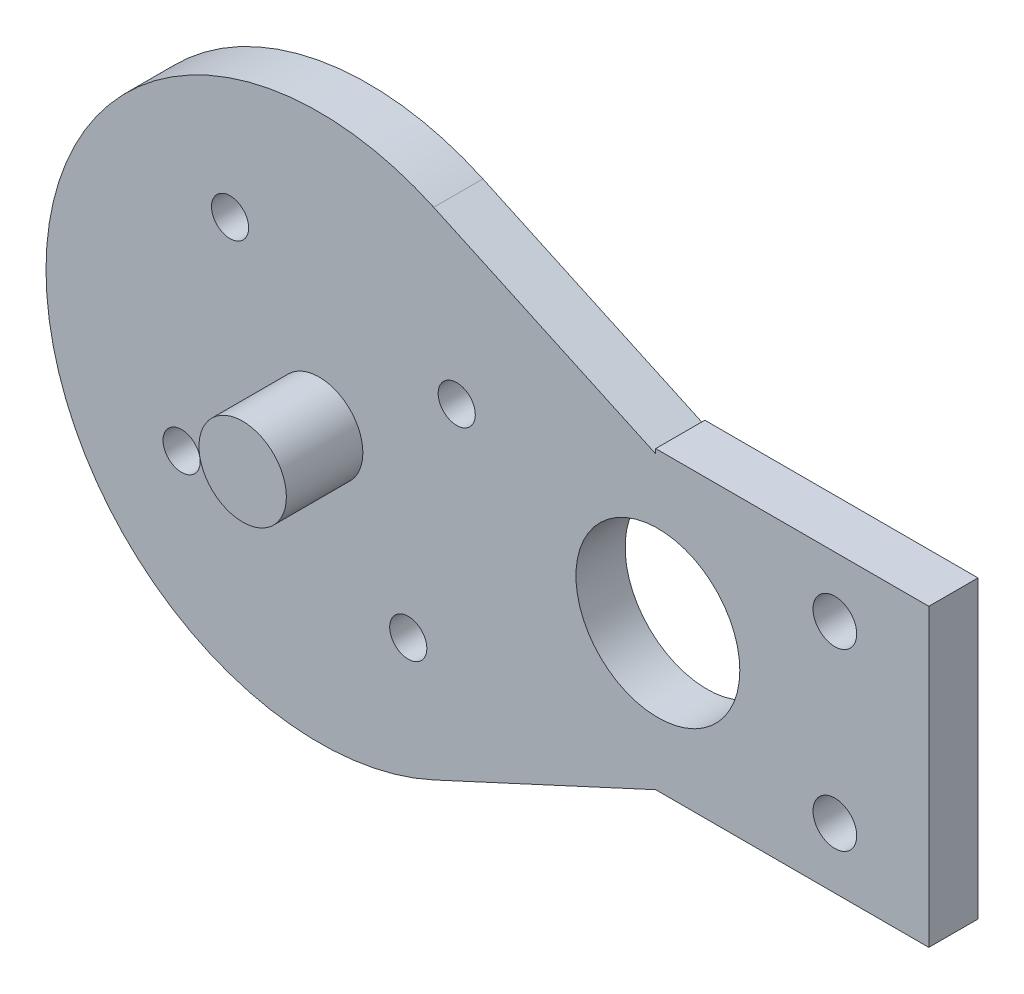
ISO-10303-21;
HEADER;
FILE_DESCRIPTION(('STEP AP214'),'2;1');
FILE_NAME('part.step','',(''),(''),'','','');
FILE_SCHEMA(('AUTOMOTIVE_DESIGN { 1 0 10303 214 1 1 1 1 }'));
ENDSEC;
DATA;
#1=APPLICATION_CONTEXT('core data for automotive mechanical design processes');
#2=APPLICATION_PROTOCOL_DEFINITION('international standard','automotive_design',2000,#1);
#3=PRODUCT_CONTEXT('',#1,'mechanical');
#4=PRODUCT('Part','Part','',(#3));
#5=PRODUCT_RELATED_PRODUCT_CATEGORY('part','',(#4));
#6=PRODUCT_DEFINITION_FORMATION('','',#4);
#7=PRODUCT_DEFINITION_CONTEXT('part definition',#1,'design');
#8=PRODUCT_DEFINITION('design','',#6,#7);
#9=PRODUCT_DEFINITION_SHAPE('','',#8);
#10=(LENGTH_UNIT() NAMED_UNIT(*) SI_UNIT(.MILLI.,.METRE.));
#11=(NAMED_UNIT(*) PLANE_ANGLE_UNIT() SI_UNIT($,.RADIAN.));
#12=(NAMED_UNIT(*) SI_UNIT($,.STERADIAN.) SOLID_ANGLE_UNIT());
#13=UNCERTAINTY_MEASURE_WITH_UNIT(LENGTH_MEASURE(1.E-05),#10,'distance_accuracy_value','');
#14=(GEOMETRIC_REPRESENTATION_CONTEXT(3) GLOBAL_UNCERTAINTY_ASSIGNED_CONTEXT((#13)) GLOBAL_UNIT_ASSIGNED_CONTEXT((#10,
#11,#12)) REPRESENTATION_CONTEXT('',''));
#15=CARTESIAN_POINT('',(0.,0.,0.));
#16=DIRECTION('',(0.,0.,1.));
#17=DIRECTION('',(1.,0.,0.));
#18=AXIS2_PLACEMENT_3D('',#15,#16,#17);
#19=CARTESIAN_POINT('',(47.1978168557016,-7.77364887585196,-36.8242867378433));
#20=DIRECTION('',(0.,0.,1.));
#21=DIRECTION('',(1.,0.,0.));
#22=AXIS2_PLACEMENT_3D('',#19,#20,#21);
#23=CYLINDRICAL_SURFACE('',#22,0.999999999999984);
#24=CARTESIAN_POINT('',(47.1978168557016,-7.77364887585196,0.));
#25=DIRECTION('',(0.,0.,1.));
#26=DIRECTION('',(1.,0.,0.));
#27=AXIS2_PLACEMENT_3D('',#24,#25,#26);
#28=CIRCLE('',#27,0.999999999999984);
#29=CARTESIAN_POINT('',(48.1978168557016,-7.77364887585196,0.));
#30=VERTEX_POINT('',#29);
#31=EDGE_CURVE('E133',#30,#30,#28,.F.);
#32=ORIENTED_EDGE('',*,*,#31,.T.);
#33=EDGE_LOOP('',(#32));
#34=FACE_BOUND('',#33,.T.);
#35=CARTESIAN_POINT('',(47.1978168557016,-7.77364887585196,1.5));
#36=DIRECTION('',(0.,0.,1.));
#37=DIRECTION('',(1.,0.,0.));
#38=AXIS2_PLACEMENT_3D('',#35,#36,#37);
#39=CIRCLE('',#38,0.999999999999984);
#40=CARTESIAN_POINT('',(48.1978168557016,-7.77364887585196,1.5));
#41=VERTEX_POINT('',#40);
#42=EDGE_CURVE('E39',#41,#41,#39,.F.);
#43=ORIENTED_EDGE('',*,*,#42,.F.);
#44=EDGE_LOOP('',(#43));
#45=FACE_BOUND('',#44,.T.);
#46=ADVANCED_FACE('F35',(#34,#45),#23,.F.);
#47=CARTESIAN_POINT('',(47.1978168557015,8.22635112414804,-36.8242867378433));
#48=DIRECTION('',(0.,0.,1.));
#49=DIRECTION('',(1.,0.,0.));
#50=AXIS2_PLACEMENT_3D('',#47,#48,#49);
#51=CYLINDRICAL_SURFACE('',#50,0.999999999999991);
#52=CARTESIAN_POINT('',(47.1978168557015,8.22635112414804,0.));
#53=DIRECTION('',(0.,0.,1.));
#54=DIRECTION('',(1.,0.,0.));
#55=AXIS2_PLACEMENT_3D('',#52,#53,#54);
#56=CIRCLE('',#55,0.999999999999991);
#57=CARTESIAN_POINT('',(48.1978168557015,8.22635112414804,0.));
#58=VERTEX_POINT('',#57);
#59=EDGE_CURVE('E129',#58,#58,#56,.F.);
#60=ORIENTED_EDGE('',*,*,#59,.T.);
#61=EDGE_LOOP('',(#60));
#62=FACE_BOUND('',#61,.T.);
#63=CARTESIAN_POINT('',(47.1978168557015,8.22635112414804,1.5));
#64=DIRECTION('',(0.,0.,1.));
#65=DIRECTION('',(1.,0.,0.));
#66=AXIS2_PLACEMENT_3D('',#63,#64,#65);
#67=CIRCLE('',#66,0.999999999999991);
#68=CARTESIAN_POINT('',(48.1978168557015,8.22635112414804,1.5));
#69=VERTEX_POINT('',#68);
#70=EDGE_CURVE('E221',#69,#69,#67,.F.);
#71=ORIENTED_EDGE('',*,*,#70,.F.);
#72=EDGE_LOOP('',(#71));
#73=FACE_BOUND('',#72,.T.);
#74=ADVANCED_FACE('F265',(#62,#73),#51,.F.);
#75=CARTESIAN_POINT('',(36.0322580645161,-10.8938688615254,4.5));
#76=DIRECTION('',(-0.419354838709678,0.907822405127115,0.));
#77=DIRECTION('',(-0.907822405127115,-0.419354838709678,0.));
#78=AXIS2_PLACEMENT_3D('',#75,#76,#77);
#79=PLANE('',#78);
#80=DIRECTION('',(0.,0.,1.));
#81=VECTOR('',#80,1.);
#82=CARTESIAN_POINT('',(30.7986447857433,-13.3114574118777,-36.8242867378433));
#83=LINE('',#82,#81);
#84=CARTESIAN_POINT('',(30.7986447857433,-13.3114574118777,0.));
#85=VERTEX_POINT('',#84);
#86=CARTESIAN_POINT('',(30.7986447857433,-13.3114574118777,4.5));
#87=VERTEX_POINT('',#86);
#88=EDGE_CURVE('E144',#85,#87,#83,.T.);
#89=ORIENTED_EDGE('',*,*,#88,.T.);
#90=DIRECTION('',(0.907822405127115,0.419354838709678,0.));
#91=VECTOR('',#90,1.);
#92=CARTESIAN_POINT('',(36.0322580645161,-10.8938688615254,4.5));
#93=LINE('',#92,#91);
#94=CARTESIAN_POINT('',(10.4838709677419,-22.6955601281779,4.5));
#95=VERTEX_POINT('',#94);
#96=EDGE_CURVE('E202',#95,#87,#93,.T.);
#97=ORIENTED_EDGE('',*,*,#96,.F.);
#98=DIRECTION('',(0.,0.,-1.));
#99=VECTOR('',#98,1.);
#100=CARTESIAN_POINT('',(10.4838709677419,-22.6955601281779,4.5));
#101=LINE('',#100,#99);
#102=CARTESIAN_POINT('',(10.4838709677419,-22.6955601281779,0.));
#103=VERTEX_POINT('',#102);
#104=EDGE_CURVE('E11',#95,#103,#101,.T.);
#105=ORIENTED_EDGE('',*,*,#104,.T.);
#106=DIRECTION('',(0.907822405127115,0.419354838709678,0.));
#107=VECTOR('',#106,1.);
#108=CARTESIAN_POINT('',(36.0322580645161,-10.8938688615254,0.));
#109=LINE('',#108,#107);
#110=EDGE_CURVE('E207',#103,#85,#109,.T.);
#111=ORIENTED_EDGE('',*,*,#110,.T.);
#112=EDGE_LOOP('',(#89,#97,#105,#111));
#113=FACE_BOUND('',#112,.T.);
#114=ADVANCED_FACE('F245',(#113),#79,.F.);
#115=CARTESIAN_POINT('',(0.,0.,4.5));
#116=DIRECTION('',(0.,0.,1.));
#117=DIRECTION('',(1.,0.,0.));
#118=AXIS2_PLACEMENT_3D('',#115,#116,#117);
#119=PLANE('',#118);
#120=CARTESIAN_POINT('',(47.1978168557015,8.22635112414804,4.5));
#121=DIRECTION('',(0.,0.,1.));
#122=DIRECTION('',(1.,0.,0.));
#123=AXIS2_PLACEMENT_3D('',#120,#121,#122);
#124=CIRCLE('',#123,2.);
#125=CARTESIAN_POINT('',(49.1978168557015,8.22635112414804,4.5));
#126=VERTEX_POINT('',#125);
#127=EDGE_CURVE('E228',#126,#126,#124,.T.);
#128=ORIENTED_EDGE('',*,*,#127,.F.);
#129=EDGE_LOOP('',(#128));
#130=FACE_BOUND('',#129,.T.);
#131=CARTESIAN_POINT('',(47.1978168557016,-7.77364887585196,4.5));
#132=DIRECTION('',(0.,0.,1.));
#133=DIRECTION('',(1.,0.,0.));
#134=AXIS2_PLACEMENT_3D('',#131,#132,#133);
#135=CIRCLE('',#134,2.);
#136=CARTESIAN_POINT('',(49.1978168557016,-7.77364887585196,4.5));
#137=VERTEX_POINT('',#136);
#138=EDGE_CURVE('E238',#137,#137,#135,.T.);
#139=ORIENTED_EDGE('',*,*,#138,.F.);
#140=EDGE_LOOP('',(#139));
#141=FACE_BOUND('',#140,.T.);
#142=DIRECTION('',(0.,-1.,0.));
#143=VECTOR('',#142,1.);
#144=CARTESIAN_POINT('',(30.7986447857433,0.,4.5));
#145=LINE('',#144,#143);
#146=CARTESIAN_POINT('',(30.7986447857433,13.7260737947784,4.5));
#147=VERTEX_POINT('',#146);
#148=CARTESIAN_POINT('',(30.7986447857433,13.3114574118777,4.5));
#149=VERTEX_POINT('',#148);
#150=EDGE_CURVE('E125',#147,#149,#145,.T.);
#151=ORIENTED_EDGE('',*,*,#150,.T.);
#152=DIRECTION('',(-0.907822405127115,0.419354838709677,0.));
#153=VECTOR('',#152,1.);
#154=CARTESIAN_POINT('',(10.4838709677419,22.6955601281779,4.5));
#155=LINE('',#154,#153);
#156=CARTESIAN_POINT('',(10.4838709677419,22.6955601281779,4.5));
#157=VERTEX_POINT('',#156);
#158=EDGE_CURVE('E54',#149,#157,#155,.T.);
#159=ORIENTED_EDGE('',*,*,#158,.T.);
#160=CARTESIAN_POINT('',(0.,0.,4.5));
#161=DIRECTION('',(0.,0.,1.));
#162=DIRECTION('',(1.,0.,0.));
#163=AXIS2_PLACEMENT_3D('',#160,#161,#162);
#164=CIRCLE('',#163,25.);
#165=EDGE_CURVE('E200',#157,#95,#164,.T.);
#166=ORIENTED_EDGE('',*,*,#165,.T.);
#167=ORIENTED_EDGE('',*,*,#96,.T.);
#168=DIRECTION('',(-1.,0.,0.));
#169=VECTOR('',#168,1.);
#170=CARTESIAN_POINT('',(0.,-13.3114574118777,4.5));
#171=LINE('',#170,#169);
#172=CARTESIAN_POINT('',(55.7986447857433,-13.3114574118777,4.5));
#173=VERTEX_POINT('',#172);
#174=EDGE_CURVE('E118',#173,#87,#171,.T.);
#175=ORIENTED_EDGE('',*,*,#174,.F.);
#176=DIRECTION('',(0.,-1.,0.));
#177=VECTOR('',#176,1.);
#178=CARTESIAN_POINT('',(55.7986447857433,0.,4.5));
#179=LINE('',#178,#177);
#180=CARTESIAN_POINT('',(55.7986447857433,13.7260737947784,4.5));
#181=VERTEX_POINT('',#180);
#182=EDGE_CURVE('E107',#181,#173,#179,.T.);
#183=ORIENTED_EDGE('',*,*,#182,.F.);
#184=DIRECTION('',(-1.,0.,0.));
#185=VECTOR('',#184,1.);
#186=CARTESIAN_POINT('',(0.,13.7260737947784,4.5));
#187=LINE('',#186,#185);
#188=EDGE_CURVE('E116',#181,#147,#187,.T.);
#189=ORIENTED_EDGE('',*,*,#188,.T.);
#190=EDGE_LOOP('',(#151,#159,#166,#167,#175,#183,#189));
#191=FACE_BOUND('',#190,.T.);
#192=CARTESIAN_POINT('',(31.,0.,4.5));
#193=DIRECTION('',(0.,0.,1.));
#194=DIRECTION('',(1.,0.,0.));
#195=AXIS2_PLACEMENT_3D('',#192,#193,#194);
#196=CIRCLE('',#195,7.5);
#197=CARTESIAN_POINT('',(38.5,0.,4.5));
#198=VERTEX_POINT('',#197);
#199=EDGE_CURVE('E192',#198,#198,#196,.T.);
#200=ORIENTED_EDGE('',*,*,#199,.F.);
#201=EDGE_LOOP('',(#200));
#202=FACE_BOUND('',#201,.T.);
#203=CARTESIAN_POINT('',(0.,0.,4.5));
#204=DIRECTION('',(0.,0.,1.));
#205=DIRECTION('',(1.,0.,0.));
#206=AXIS2_PLACEMENT_3D('',#203,#204,#205);
#207=CIRCLE('',#206,4.);
#208=CARTESIAN_POINT('',(4.,0.,4.5));
#209=VERTEX_POINT('',#208);
#210=EDGE_CURVE('E178',#209,#209,#207,.T.);
#211=ORIENTED_EDGE('',*,*,#210,.F.);
#212=EDGE_LOOP('',(#211));
#213=FACE_BOUND('',#212,.T.);
#214=CARTESIAN_POINT('',(-12.5899519946081,-8.15433067599359,4.5));
#215=DIRECTION('',(0.,0.,1.));
#216=DIRECTION('',(1.,0.,0.));
#217=AXIS2_PLACEMENT_3D('',#214,#215,#216);
#218=CIRCLE('',#217,1.7);
#219=CARTESIAN_POINT('',(-10.8899519946081,-8.15433067599359,4.5));
#220=VERTEX_POINT('',#219);
#221=EDGE_CURVE('E141',#220,#220,#218,.T.);
#222=ORIENTED_EDGE('',*,*,#221,.F.);
#223=EDGE_LOOP('',(#222));
#224=FACE_BOUND('',#223,.T.);
#225=CARTESIAN_POINT('',(8.15433067599418,-12.5899519946082,4.5));
#226=DIRECTION('',(0.,0.,1.));
#227=DIRECTION('',(1.,0.,0.));
#228=AXIS2_PLACEMENT_3D('',#225,#226,#227);
#229=CIRCLE('',#228,1.7);
#230=CARTESIAN_POINT('',(9.85433067599419,-12.5899519946082,4.5));
#231=VERTEX_POINT('',#230);
#232=EDGE_CURVE('E167',#231,#231,#229,.T.);
#233=ORIENTED_EDGE('',*,*,#232,.F.);
#234=EDGE_LOOP('',(#233));
#235=FACE_BOUND('',#234,.T.);
#236=CARTESIAN_POINT('',(12.5899519946088,8.15433067599406,4.5));
#237=DIRECTION('',(0.,0.,1.));
#238=DIRECTION('',(1.,0.,0.));
#239=AXIS2_PLACEMENT_3D('',#236,#237,#238);
#240=CIRCLE('',#239,1.7);
#241=CARTESIAN_POINT('',(14.2899519946088,8.15433067599406,4.5));
#242=VERTEX_POINT('',#241);
#243=EDGE_CURVE('E161',#242,#242,#240,.T.);
#244=ORIENTED_EDGE('',*,*,#243,.F.);
#245=EDGE_LOOP('',(#244));
#246=FACE_BOUND('',#245,.T.);
#247=CARTESIAN_POINT('',(-8.15433067599347,12.5899519946087,4.5));
#248=DIRECTION('',(0.,0.,1.));
#249=DIRECTION('',(1.,0.,0.));
#250=AXIS2_PLACEMENT_3D('',#247,#248,#249);
#251=CIRCLE('',#250,1.7);
#252=CARTESIAN_POINT('',(-6.45433067599347,12.5899519946087,4.5));
#253=VERTEX_POINT('',#252);
#254=EDGE_CURVE('E155',#253,#253,#251,.T.);
#255=ORIENTED_EDGE('',*,*,#254,.F.);
#256=EDGE_LOOP('',(#255));
#257=FACE_BOUND('',#256,.T.);
#258=ADVANCED_FACE('F114',(#130,#141,#191,#202,#213,#224,#235,#246,#257),#119,.T.);
#259=CARTESIAN_POINT('',(0.,0.,0.));
#260=DIRECTION('',(0.,0.,1.));
#261=DIRECTION('',(1.,0.,0.));
#262=AXIS2_PLACEMENT_3D('',#259,#260,#261);
#263=PLANE('',#262);
#264=DIRECTION('',(1.,0.,0.));
#265=VECTOR('',#264,1.);
#266=CARTESIAN_POINT('',(0.,-13.3114574118777,0.));
#267=LINE('',#266,#265);
#268=CARTESIAN_POINT('',(55.7986447857433,-13.3114574118777,0.));
#269=VERTEX_POINT('',#268);
#270=EDGE_CURVE('E119',#85,#269,#267,.T.);
#271=ORIENTED_EDGE('',*,*,#270,.F.);
#272=ORIENTED_EDGE('',*,*,#110,.F.);
#273=CARTESIAN_POINT('',(0.,0.,0.));
#274=DIRECTION('',(0.,0.,1.));
#275=DIRECTION('',(1.,0.,0.));
#276=AXIS2_PLACEMENT_3D('',#273,#274,#275);
#277=CIRCLE('',#276,25.);
#278=CARTESIAN_POINT('',(10.4838709677419,22.6955601281779,0.));
#279=VERTEX_POINT('',#278);
#280=EDGE_CURVE('E65',#279,#103,#277,.T.);
#281=ORIENTED_EDGE('',*,*,#280,.F.);
#282=DIRECTION('',(-0.907822405127115,0.419354838709677,0.));
#283=VECTOR('',#282,1.);
#284=CARTESIAN_POINT('',(10.4838709677419,22.6955601281779,0.));
#285=LINE('',#284,#283);
#286=CARTESIAN_POINT('',(30.7986447857433,13.3114574118777,0.));
#287=VERTEX_POINT('',#286);
#288=EDGE_CURVE('E203',#287,#279,#285,.T.);
#289=ORIENTED_EDGE('',*,*,#288,.F.);
#290=DIRECTION('',(0.,1.,0.));
#291=VECTOR('',#290,1.);
#292=CARTESIAN_POINT('',(30.7986447857433,0.,0.));
#293=LINE('',#292,#291);
#294=CARTESIAN_POINT('',(30.7986447857433,13.7260737947784,0.));
#295=VERTEX_POINT('',#294);
#296=EDGE_CURVE('E127',#287,#295,#293,.T.);
#297=ORIENTED_EDGE('',*,*,#296,.T.);
#298=DIRECTION('',(1.,0.,0.));
#299=VECTOR('',#298,1.);
#300=CARTESIAN_POINT('',(0.,13.7260737947784,0.));
#301=LINE('',#300,#299);
#302=CARTESIAN_POINT('',(55.7986447857433,13.7260737947784,0.));
#303=VERTEX_POINT('',#302);
#304=EDGE_CURVE('E139',#295,#303,#301,.T.);
#305=ORIENTED_EDGE('',*,*,#304,.T.);
#306=DIRECTION('',(0.,1.,0.));
#307=VECTOR('',#306,1.);
#308=CARTESIAN_POINT('',(55.7986447857433,0.,0.));
#309=LINE('',#308,#307);
#310=EDGE_CURVE('E75',#269,#303,#309,.T.);
#311=ORIENTED_EDGE('',*,*,#310,.F.);
#312=EDGE_LOOP('',(#271,#272,#281,#289,#297,#305,#311));
#313=FACE_BOUND('',#312,.T.);
#314=CARTESIAN_POINT('',(-8.15433067599347,12.5899519946087,0.));
#315=DIRECTION('',(0.,0.,1.));
#316=DIRECTION('',(1.,0.,0.));
#317=AXIS2_PLACEMENT_3D('',#314,#315,#316);
#318=CIRCLE('',#317,1.);
#319=CARTESIAN_POINT('',(-7.15433067599347,12.5899519946087,0.));
#320=VERTEX_POINT('',#319);
#321=EDGE_CURVE('E175',#320,#320,#318,.T.);
#322=ORIENTED_EDGE('',*,*,#321,.T.);
#323=EDGE_LOOP('',(#322));
#324=FACE_BOUND('',#323,.T.);
#325=CARTESIAN_POINT('',(12.5899519946088,8.15433067599406,0.));
#326=DIRECTION('',(0.,0.,1.));
#327=DIRECTION('',(1.,0.,0.));
#328=AXIS2_PLACEMENT_3D('',#325,#326,#327);
#329=CIRCLE('',#328,1.00000000000058);
#330=CARTESIAN_POINT('',(13.5899519946094,8.15433067599406,0.));
#331=VERTEX_POINT('',#330);
#332=EDGE_CURVE('E179',#331,#331,#329,.T.);
#333=ORIENTED_EDGE('',*,*,#332,.T.);
#334=EDGE_LOOP('',(#333));
#335=FACE_BOUND('',#334,.T.);
#336=CARTESIAN_POINT('',(8.15433067599418,-12.5899519946082,0.));
#337=DIRECTION('',(0.,0.,1.));
#338=DIRECTION('',(1.,0.,0.));
#339=AXIS2_PLACEMENT_3D('',#336,#337,#338);
#340=CIRCLE('',#339,1.00000000000093);
#341=CARTESIAN_POINT('',(9.15433067599512,-12.5899519946082,0.));
#342=VERTEX_POINT('',#341);
#343=EDGE_CURVE('E182',#342,#342,#340,.T.);
#344=ORIENTED_EDGE('',*,*,#343,.T.);
#345=EDGE_LOOP('',(#344));
#346=FACE_BOUND('',#345,.T.);
#347=CARTESIAN_POINT('',(-12.5899519946081,-8.15433067599359,0.));
#348=DIRECTION('',(0.,0.,1.));
#349=DIRECTION('',(1.,0.,0.));
#350=AXIS2_PLACEMENT_3D('',#347,#348,#349);
#351=CIRCLE('',#350,1.00000000000045);
#352=CARTESIAN_POINT('',(-11.5899519946077,-8.15433067599359,0.));
#353=VERTEX_POINT('',#352);
#354=EDGE_CURVE('E185',#353,#353,#351,.T.);
#355=ORIENTED_EDGE('',*,*,#354,.T.);
#356=EDGE_LOOP('',(#355));
#357=FACE_BOUND('',#356,.T.);
#358=CARTESIAN_POINT('',(31.,0.,0.));
#359=DIRECTION('',(0.,0.,1.));
#360=DIRECTION('',(1.,0.,0.));
#361=AXIS2_PLACEMENT_3D('',#358,#359,#360);
#362=CIRCLE('',#361,7.5);
#363=CARTESIAN_POINT('',(38.5,0.,0.));
#364=VERTEX_POINT('',#363);
#365=EDGE_CURVE('E195',#364,#364,#362,.T.);
#366=ORIENTED_EDGE('',*,*,#365,.T.);
#367=EDGE_LOOP('',(#366));
#368=FACE_BOUND('',#367,.T.);
#369=ORIENTED_EDGE('',*,*,#59,.F.);
#370=EDGE_LOOP('',(#369));
#371=FACE_BOUND('',#370,.T.);
#372=ORIENTED_EDGE('',*,*,#31,.F.);
#373=EDGE_LOOP('',(#372));
#374=FACE_BOUND('',#373,.T.);
#375=ADVANCED_FACE('F249',(#313,#324,#335,#346,#357,#368,#371,#374),#263,.F.);
#376=CARTESIAN_POINT('',(-12.5899519946081,-8.15433067599359,0.));
#377=DIRECTION('',(0.,0.,1.));
#378=DIRECTION('',(1.,0.,0.));
#379=AXIS2_PLACEMENT_3D('',#376,#377,#378);
#380=CYLINDRICAL_SURFACE('',#379,1.00000000000045);
#381=ORIENTED_EDGE('',*,*,#354,.F.);
#382=EDGE_LOOP('',(#381));
#383=FACE_BOUND('',#382,.T.);
#384=CARTESIAN_POINT('',(-12.5899519946081,-8.15433067599359,2.1));
#385=DIRECTION('',(0.,0.,1.));
#386=DIRECTION('',(1.,0.,0.));
#387=AXIS2_PLACEMENT_3D('',#384,#385,#386);
#388=CIRCLE('',#387,1.00000000000045);
#389=CARTESIAN_POINT('',(-11.5899519946077,-8.15433067599359,2.1));
#390=VERTEX_POINT('',#389);
#391=EDGE_CURVE('E188',#390,#390,#388,.F.);
#392=ORIENTED_EDGE('',*,*,#391,.F.);
#393=EDGE_LOOP('',(#392));
#394=FACE_BOUND('',#393,.T.);
#395=ADVANCED_FACE('F354',(#383,#394),#380,.F.);
#396=CARTESIAN_POINT('',(8.15433067599418,-12.5899519946082,0.));
#397=DIRECTION('',(0.,0.,1.));
#398=DIRECTION('',(1.,0.,0.));
#399=AXIS2_PLACEMENT_3D('',#396,#397,#398);
#400=CYLINDRICAL_SURFACE('',#399,1.00000000000093);
#401=ORIENTED_EDGE('',*,*,#343,.F.);
#402=EDGE_LOOP('',(#401));
#403=FACE_BOUND('',#402,.T.);
#404=CARTESIAN_POINT('',(8.15433067599418,-12.5899519946082,2.1));
#405=DIRECTION('',(0.,0.,1.));
#406=DIRECTION('',(1.,0.,0.));
#407=AXIS2_PLACEMENT_3D('',#404,#405,#406);
#408=CIRCLE('',#407,1.00000000000093);
#409=CARTESIAN_POINT('',(9.15433067599512,-12.5899519946082,2.1));
#410=VERTEX_POINT('',#409);
#411=EDGE_CURVE('E217',#410,#410,#408,.F.);
#412=ORIENTED_EDGE('',*,*,#411,.F.);
#413=EDGE_LOOP('',(#412));
#414=FACE_BOUND('',#413,.T.);
#415=ADVANCED_FACE('F488',(#403,#414),#400,.F.);
#416=CARTESIAN_POINT('',(12.5899519946088,8.15433067599406,0.));
#417=DIRECTION('',(0.,0.,1.));
#418=DIRECTION('',(1.,0.,0.));
#419=AXIS2_PLACEMENT_3D('',#416,#417,#418);
#420=CYLINDRICAL_SURFACE('',#419,1.00000000000058);
#421=ORIENTED_EDGE('',*,*,#332,.F.);
#422=EDGE_LOOP('',(#421));
#423=FACE_BOUND('',#422,.T.);
#424=CARTESIAN_POINT('',(12.5899519946088,8.15433067599406,2.1));
#425=DIRECTION('',(0.,0.,1.));
#426=DIRECTION('',(1.,0.,0.));
#427=AXIS2_PLACEMENT_3D('',#424,#425,#426);
#428=CIRCLE('',#427,1.00000000000058);
#429=CARTESIAN_POINT('',(13.5899519946094,8.15433067599406,2.1));
#430=VERTEX_POINT('',#429);
#431=EDGE_CURVE('E214',#430,#430,#428,.F.);
#432=ORIENTED_EDGE('',*,*,#431,.F.);
#433=EDGE_LOOP('',(#432));
#434=FACE_BOUND('',#433,.T.);
#435=ADVANCED_FACE('F477',(#423,#434),#420,.F.);
#436=CARTESIAN_POINT('',(-8.15433067599347,12.5899519946087,0.));
#437=DIRECTION('',(0.,0.,1.));
#438=DIRECTION('',(1.,0.,0.));
#439=AXIS2_PLACEMENT_3D('',#436,#437,#438);
#440=CYLINDRICAL_SURFACE('',#439,1.);
#441=ORIENTED_EDGE('',*,*,#321,.F.);
#442=EDGE_LOOP('',(#441));
#443=FACE_BOUND('',#442,.T.);
#444=CARTESIAN_POINT('',(-8.15433067599347,12.5899519946087,2.1));
#445=DIRECTION('',(0.,0.,1.));
#446=DIRECTION('',(1.,0.,0.));
#447=AXIS2_PLACEMENT_3D('',#444,#445,#446);
#448=CIRCLE('',#447,1.);
#449=CARTESIAN_POINT('',(-7.15433067599347,12.5899519946087,2.1));
#450=VERTEX_POINT('',#449);
#451=EDGE_CURVE('E154',#450,#450,#448,.F.);
#452=ORIENTED_EDGE('',*,*,#451,.F.);
#453=EDGE_LOOP('',(#452));
#454=FACE_BOUND('',#453,.T.);
#455=ADVANCED_FACE('F384',(#443,#454),#440,.F.);
#456=CARTESIAN_POINT('',(0.,0.,4.5));
#457=DIRECTION('',(0.,0.,-1.));
#458=DIRECTION('',(-1.,0.,0.));
#459=AXIS2_PLACEMENT_3D('',#456,#457,#458);
#460=CYLINDRICAL_SURFACE('',#459,25.);
#461=ORIENTED_EDGE('',*,*,#104,.F.);
#462=ORIENTED_EDGE('',*,*,#165,.F.);
#463=DIRECTION('',(0.,0.,-1.));
#464=VECTOR('',#463,1.);
#465=CARTESIAN_POINT('',(10.4838709677419,22.6955601281779,4.5));
#466=LINE('',#465,#464);
#467=EDGE_CURVE('E45',#157,#279,#466,.T.);
#468=ORIENTED_EDGE('',*,*,#467,.T.);
#469=ORIENTED_EDGE('',*,*,#280,.T.);
#470=EDGE_LOOP('',(#461,#462,#468,#469));
#471=FACE_BOUND('',#470,.T.);
#472=ADVANCED_FACE('F37',(#471),#460,.T.);
#473=CARTESIAN_POINT('',(10.4838709677419,22.6955601281779,4.5));
#474=DIRECTION('',(-0.419354838709677,-0.907822405127116,0.));
#475=DIRECTION('',(0.907822405127116,-0.419354838709677,0.));
#476=AXIS2_PLACEMENT_3D('',#473,#474,#475);
#477=PLANE('',#476);
#478=ORIENTED_EDGE('',*,*,#158,.F.);
#479=DIRECTION('',(0.,0.,1.));
#480=VECTOR('',#479,1.);
#481=CARTESIAN_POINT('',(30.7986447857433,13.3114574118777,-36.8242867378433));
#482=LINE('',#481,#480);
#483=EDGE_CURVE('E136',#287,#149,#482,.T.);
#484=ORIENTED_EDGE('',*,*,#483,.F.);
#485=ORIENTED_EDGE('',*,*,#288,.T.);
#486=ORIENTED_EDGE('',*,*,#467,.F.);
#487=EDGE_LOOP('',(#478,#484,#485,#486));
#488=FACE_BOUND('',#487,.T.);
#489=ADVANCED_FACE('F252',(#488),#477,.F.);
#490=CARTESIAN_POINT('',(31.,0.,0.));
#491=DIRECTION('',(0.,0.,1.));
#492=DIRECTION('',(1.,0.,0.));
#493=AXIS2_PLACEMENT_3D('',#490,#491,#492);
#494=CYLINDRICAL_SURFACE('',#493,7.5);
#495=ORIENTED_EDGE('',*,*,#365,.F.);
#496=EDGE_LOOP('',(#495));
#497=FACE_BOUND('',#496,.T.);
#498=ORIENTED_EDGE('',*,*,#199,.T.);
#499=EDGE_LOOP('',(#498));
#500=FACE_BOUND('',#499,.T.);
#501=ADVANCED_FACE('F523',(#497,#500),#494,.F.);
#502=CARTESIAN_POINT('',(0.,0.,11.5));
#503=DIRECTION('',(0.,0.,-1.));
#504=DIRECTION('',(-1.,0.,0.));
#505=AXIS2_PLACEMENT_3D('',#502,#503,#504);
#506=CYLINDRICAL_SURFACE('',#505,4.);
#507=CARTESIAN_POINT('',(0.,0.,11.5));
#508=DIRECTION('',(0.,0.,1.));
#509=DIRECTION('',(1.,0.,0.));
#510=AXIS2_PLACEMENT_3D('',#507,#508,#509);
#511=CIRCLE('',#510,4.);
#512=CARTESIAN_POINT('',(4.,0.,11.5));
#513=VERTEX_POINT('',#512);
#514=EDGE_CURVE('E189',#513,#513,#511,.T.);
#515=ORIENTED_EDGE('',*,*,#514,.F.);
#516=EDGE_LOOP('',(#515));
#517=FACE_BOUND('',#516,.T.);
#518=ORIENTED_EDGE('',*,*,#210,.T.);
#519=EDGE_LOOP('',(#518));
#520=FACE_BOUND('',#519,.T.);
#521=ADVANCED_FACE('F513',(#517,#520),#506,.T.);
#522=CARTESIAN_POINT('',(0.,0.,11.5));
#523=DIRECTION('',(0.,0.,1.));
#524=DIRECTION('',(1.,0.,0.));
#525=AXIS2_PLACEMENT_3D('',#522,#523,#524);
#526=PLANE('',#525);
#527=ORIENTED_EDGE('',*,*,#514,.T.);
#528=EDGE_LOOP('',(#527));
#529=FACE_BOUND('',#528,.T.);
#530=ADVANCED_FACE('F467',(#529),#526,.T.);
#531=CARTESIAN_POINT('',(-8.15433067599347,12.5899519946087,2.1));
#532=DIRECTION('',(0.,0.,1.));
#533=DIRECTION('',(1.,0.,0.));
#534=AXIS2_PLACEMENT_3D('',#531,#532,#533);
#535=PLANE('',#534);
#536=CARTESIAN_POINT('',(-8.15433067599347,12.5899519946087,2.1));
#537=DIRECTION('',(0.,0.,1.));
#538=DIRECTION('',(1.,0.,0.));
#539=AXIS2_PLACEMENT_3D('',#536,#537,#538);
#540=CIRCLE('',#539,1.7);
#541=CARTESIAN_POINT('',(-6.45433067599347,12.5899519946087,2.1));
#542=VERTEX_POINT('',#541);
#543=EDGE_CURVE('E151',#542,#542,#540,.T.);
#544=ORIENTED_EDGE('',*,*,#543,.T.);
#545=EDGE_LOOP('',(#544));
#546=FACE_BOUND('',#545,.T.);
#547=ORIENTED_EDGE('',*,*,#451,.T.);
#548=EDGE_LOOP('',(#547));
#549=FACE_BOUND('',#548,.T.);
#550=ADVANCED_FACE('F458',(#546,#549),#535,.T.);
#551=CARTESIAN_POINT('',(-8.15433067599347,12.5899519946087,2.1));
#552=DIRECTION('',(0.,0.,1.));
#553=DIRECTION('',(1.,0.,0.));
#554=AXIS2_PLACEMENT_3D('',#551,#552,#553);
#555=CYLINDRICAL_SURFACE('',#554,1.7);
#556=ORIENTED_EDGE('',*,*,#543,.F.);
#557=EDGE_LOOP('',(#556));
#558=FACE_BOUND('',#557,.T.);
#559=ORIENTED_EDGE('',*,*,#254,.T.);
#560=EDGE_LOOP('',(#559));
#561=FACE_BOUND('',#560,.T.);
#562=ADVANCED_FACE('F448',(#558,#561),#555,.F.);
#563=CARTESIAN_POINT('',(12.5899519946088,8.15433067599406,2.1));
#564=DIRECTION('',(0.,0.,1.));
#565=DIRECTION('',(1.,0.,0.));
#566=AXIS2_PLACEMENT_3D('',#563,#564,#565);
#567=PLANE('',#566);
#568=CARTESIAN_POINT('',(12.5899519946088,8.15433067599406,2.1));
#569=DIRECTION('',(0.,0.,1.));
#570=DIRECTION('',(1.,0.,0.));
#571=AXIS2_PLACEMENT_3D('',#568,#569,#570);
#572=CIRCLE('',#571,1.7);
#573=CARTESIAN_POINT('',(14.2899519946088,8.15433067599406,2.1));
#574=VERTEX_POINT('',#573);
#575=EDGE_CURVE('E158',#574,#574,#572,.T.);
#576=ORIENTED_EDGE('',*,*,#575,.T.);
#577=EDGE_LOOP('',(#576));
#578=FACE_BOUND('',#577,.T.);
#579=ORIENTED_EDGE('',*,*,#431,.T.);
#580=EDGE_LOOP('',(#579));
#581=FACE_BOUND('',#580,.T.);
#582=ADVANCED_FACE('F438',(#578,#581),#567,.T.);
#583=CARTESIAN_POINT('',(12.5899519946088,8.15433067599406,2.1));
#584=DIRECTION('',(0.,0.,1.));
#585=DIRECTION('',(1.,0.,0.));
#586=AXIS2_PLACEMENT_3D('',#583,#584,#585);
#587=CYLINDRICAL_SURFACE('',#586,1.7);
#588=ORIENTED_EDGE('',*,*,#575,.F.);
#589=EDGE_LOOP('',(#588));
#590=FACE_BOUND('',#589,.T.);
#591=ORIENTED_EDGE('',*,*,#243,.T.);
#592=EDGE_LOOP('',(#591));
#593=FACE_BOUND('',#592,.T.);
#594=ADVANCED_FACE('F428',(#590,#593),#587,.F.);
#595=CARTESIAN_POINT('',(8.15433067599418,-12.5899519946082,2.1));
#596=DIRECTION('',(0.,0.,1.));
#597=DIRECTION('',(1.,0.,0.));
#598=AXIS2_PLACEMENT_3D('',#595,#596,#597);
#599=PLANE('',#598);
#600=CARTESIAN_POINT('',(8.15433067599418,-12.5899519946082,2.1));
#601=DIRECTION('',(0.,0.,1.));
#602=DIRECTION('',(1.,0.,0.));
#603=AXIS2_PLACEMENT_3D('',#600,#601,#602);
#604=CIRCLE('',#603,1.7);
#605=CARTESIAN_POINT('',(9.85433067599419,-12.5899519946082,2.1));
#606=VERTEX_POINT('',#605);
#607=EDGE_CURVE('E164',#606,#606,#604,.T.);
#608=ORIENTED_EDGE('',*,*,#607,.T.);
#609=EDGE_LOOP('',(#608));
#610=FACE_BOUND('',#609,.T.);
#611=ORIENTED_EDGE('',*,*,#411,.T.);
#612=EDGE_LOOP('',(#611));
#613=FACE_BOUND('',#612,.T.);
#614=ADVANCED_FACE('F418',(#610,#613),#599,.T.);
#615=CARTESIAN_POINT('',(8.15433067599418,-12.5899519946082,2.1));
#616=DIRECTION('',(0.,0.,1.));
#617=DIRECTION('',(1.,0.,0.));
#618=AXIS2_PLACEMENT_3D('',#615,#616,#617);
#619=CYLINDRICAL_SURFACE('',#618,1.7);
#620=ORIENTED_EDGE('',*,*,#607,.F.);
#621=EDGE_LOOP('',(#620));
#622=FACE_BOUND('',#621,.T.);
#623=ORIENTED_EDGE('',*,*,#232,.T.);
#624=EDGE_LOOP('',(#623));
#625=FACE_BOUND('',#624,.T.);
#626=ADVANCED_FACE('F408',(#622,#625),#619,.F.);
#627=CARTESIAN_POINT('',(-12.5899519946081,-8.15433067599359,2.1));
#628=DIRECTION('',(0.,0.,1.));
#629=DIRECTION('',(1.,0.,0.));
#630=AXIS2_PLACEMENT_3D('',#627,#628,#629);
#631=PLANE('',#630);
#632=CARTESIAN_POINT('',(-12.5899519946081,-8.15433067599359,2.1));
#633=DIRECTION('',(0.,0.,1.));
#634=DIRECTION('',(1.,0.,0.));
#635=AXIS2_PLACEMENT_3D('',#632,#633,#634);
#636=CIRCLE('',#635,1.7);
#637=CARTESIAN_POINT('',(-10.8899519946081,-8.15433067599359,2.1));
#638=VERTEX_POINT('',#637);
#639=EDGE_CURVE('E170',#638,#638,#636,.T.);
#640=ORIENTED_EDGE('',*,*,#639,.T.);
#641=EDGE_LOOP('',(#640));
#642=FACE_BOUND('',#641,.T.);
#643=ORIENTED_EDGE('',*,*,#391,.T.);
#644=EDGE_LOOP('',(#643));
#645=FACE_BOUND('',#644,.T.);
#646=ADVANCED_FACE('F397',(#642,#645),#631,.T.);
#647=CARTESIAN_POINT('',(-12.5899519946081,-8.15433067599359,2.1));
#648=DIRECTION('',(0.,0.,1.));
#649=DIRECTION('',(1.,0.,0.));
#650=AXIS2_PLACEMENT_3D('',#647,#648,#649);
#651=CYLINDRICAL_SURFACE('',#650,1.7);
#652=ORIENTED_EDGE('',*,*,#639,.F.);
#653=EDGE_LOOP('',(#652));
#654=FACE_BOUND('',#653,.T.);
#655=ORIENTED_EDGE('',*,*,#221,.T.);
#656=EDGE_LOOP('',(#655));
#657=FACE_BOUND('',#656,.T.);
#658=ADVANCED_FACE('F344',(#654,#657),#651,.F.);
#659=CARTESIAN_POINT('',(55.7986447857433,0.,-36.8242867378433));
#660=DIRECTION('',(-1.,0.,0.));
#661=DIRECTION('',(0.,0.,1.));
#662=AXIS2_PLACEMENT_3D('',#659,#660,#661);
#663=PLANE('',#662);
#664=DIRECTION('',(0.,0.,1.));
#665=VECTOR('',#664,1.);
#666=CARTESIAN_POINT('',(55.7986447857433,-13.3114574118777,-36.8242867378433));
#667=LINE('',#666,#665);
#668=EDGE_CURVE('E142',#269,#173,#667,.T.);
#669=ORIENTED_EDGE('',*,*,#668,.F.);
#670=ORIENTED_EDGE('',*,*,#310,.T.);
#671=DIRECTION('',(0.,0.,1.));
#672=VECTOR('',#671,1.);
#673=CARTESIAN_POINT('',(55.7986447857433,13.7260737947784,-36.8242867378433));
#674=LINE('',#673,#672);
#675=EDGE_CURVE('E103',#303,#181,#674,.T.);
#676=ORIENTED_EDGE('',*,*,#675,.T.);
#677=ORIENTED_EDGE('',*,*,#182,.T.);
#678=EDGE_LOOP('',(#669,#670,#676,#677));
#679=FACE_BOUND('',#678,.T.);
#680=ADVANCED_FACE('F106',(#679),#663,.F.);
#681=CARTESIAN_POINT('',(0.,-13.3114574118777,-36.8242867378433));
#682=DIRECTION('',(0.,1.,0.));
#683=DIRECTION('',(-1.,0.,0.));
#684=AXIS2_PLACEMENT_3D('',#681,#682,#683);
#685=PLANE('',#684);
#686=ORIENTED_EDGE('',*,*,#88,.F.);
#687=ORIENTED_EDGE('',*,*,#270,.T.);
#688=ORIENTED_EDGE('',*,*,#668,.T.);
#689=ORIENTED_EDGE('',*,*,#174,.T.);
#690=EDGE_LOOP('',(#686,#687,#688,#689));
#691=FACE_BOUND('',#690,.T.);
#692=ADVANCED_FACE('F242',(#691),#685,.F.);
#693=CARTESIAN_POINT('',(30.7986447857433,0.,-36.8242867378433));
#694=DIRECTION('',(-1.,0.,0.));
#695=DIRECTION('',(0.,0.,1.));
#696=AXIS2_PLACEMENT_3D('',#693,#694,#695);
#697=PLANE('',#696);
#698=ORIENTED_EDGE('',*,*,#296,.F.);
#699=ORIENTED_EDGE('',*,*,#483,.T.);
#700=ORIENTED_EDGE('',*,*,#150,.F.);
#701=DIRECTION('',(0.,0.,1.));
#702=VECTOR('',#701,1.);
#703=CARTESIAN_POINT('',(30.7986447857433,13.7260737947784,-36.8242867378433));
#704=LINE('',#703,#702);
#705=EDGE_CURVE('E123',#295,#147,#704,.T.);
#706=ORIENTED_EDGE('',*,*,#705,.F.);
#707=EDGE_LOOP('',(#698,#699,#700,#706));
#708=FACE_BOUND('',#707,.T.);
#709=ADVANCED_FACE('F254',(#708),#697,.T.);
#710=CARTESIAN_POINT('',(0.,13.7260737947784,-36.8242867378433));
#711=DIRECTION('',(0.,1.,0.));
#712=DIRECTION('',(-1.,0.,0.));
#713=AXIS2_PLACEMENT_3D('',#710,#711,#712);
#714=PLANE('',#713);
#715=ORIENTED_EDGE('',*,*,#304,.F.);
#716=ORIENTED_EDGE('',*,*,#705,.T.);
#717=ORIENTED_EDGE('',*,*,#188,.F.);
#718=ORIENTED_EDGE('',*,*,#675,.F.);
#719=EDGE_LOOP('',(#715,#716,#717,#718));
#720=FACE_BOUND('',#719,.T.);
#721=ADVANCED_FACE('F121',(#720),#714,.T.);
#722=CARTESIAN_POINT('',(47.1978168557015,8.22635112414804,1.5));
#723=DIRECTION('',(0.,0.,1.));
#724=DIRECTION('',(1.,0.,0.));
#725=AXIS2_PLACEMENT_3D('',#722,#723,#724);
#726=PLANE('',#725);
#727=CARTESIAN_POINT('',(47.1978168557015,8.22635112414804,1.5));
#728=DIRECTION('',(0.,0.,1.));
#729=DIRECTION('',(1.,0.,0.));
#730=AXIS2_PLACEMENT_3D('',#727,#728,#729);
#731=CIRCLE('',#730,2.);
#732=CARTESIAN_POINT('',(49.1978168557015,8.22635112414804,1.5));
#733=VERTEX_POINT('',#732);
#734=EDGE_CURVE('E223',#733,#733,#731,.T.);
#735=ORIENTED_EDGE('',*,*,#734,.T.);
#736=EDGE_LOOP('',(#735));
#737=FACE_BOUND('',#736,.T.);
#738=ORIENTED_EDGE('',*,*,#70,.T.);
#739=EDGE_LOOP('',(#738));
#740=FACE_BOUND('',#739,.T.);
#741=ADVANCED_FACE('F261',(#737,#740),#726,.T.);
#742=CARTESIAN_POINT('',(47.1978168557015,8.22635112414804,1.5));
#743=DIRECTION('',(0.,0.,1.));
#744=DIRECTION('',(1.,0.,0.));
#745=AXIS2_PLACEMENT_3D('',#742,#743,#744);
#746=CYLINDRICAL_SURFACE('',#745,2.);
#747=ORIENTED_EDGE('',*,*,#734,.F.);
#748=EDGE_LOOP('',(#747));
#749=FACE_BOUND('',#748,.T.);
#750=ORIENTED_EDGE('',*,*,#127,.T.);
#751=EDGE_LOOP('',(#750));
#752=FACE_BOUND('',#751,.T.);
#753=ADVANCED_FACE('F283',(#749,#752),#746,.F.);
#754=CARTESIAN_POINT('',(47.1978168557016,-7.77364887585196,1.5));
#755=DIRECTION('',(0.,0.,1.));
#756=DIRECTION('',(1.,0.,0.));
#757=AXIS2_PLACEMENT_3D('',#754,#755,#756);
#758=PLANE('',#757);
#759=CARTESIAN_POINT('',(47.1978168557016,-7.77364887585196,1.5));
#760=DIRECTION('',(0.,0.,1.));
#761=DIRECTION('',(1.,0.,0.));
#762=AXIS2_PLACEMENT_3D('',#759,#760,#761);
#763=CIRCLE('',#762,2.);
#764=CARTESIAN_POINT('',(49.1978168557016,-7.77364887585196,1.5));
#765=VERTEX_POINT('',#764);
#766=EDGE_CURVE('E233',#765,#765,#763,.T.);
#767=ORIENTED_EDGE('',*,*,#766,.T.);
#768=EDGE_LOOP('',(#767));
#769=FACE_BOUND('',#768,.T.);
#770=ORIENTED_EDGE('',*,*,#42,.T.);
#771=EDGE_LOOP('',(#770));
#772=FACE_BOUND('',#771,.T.);
#773=ADVANCED_FACE('F279',(#769,#772),#758,.T.);
#774=CARTESIAN_POINT('',(47.1978168557016,-7.77364887585196,1.5));
#775=DIRECTION('',(0.,0.,1.));
#776=DIRECTION('',(1.,0.,0.));
#777=AXIS2_PLACEMENT_3D('',#774,#775,#776);
#778=CYLINDRICAL_SURFACE('',#777,2.);
#779=ORIENTED_EDGE('',*,*,#766,.F.);
#780=EDGE_LOOP('',(#779));
#781=FACE_BOUND('',#780,.T.);
#782=ORIENTED_EDGE('',*,*,#138,.T.);
#783=EDGE_LOOP('',(#782));
#784=FACE_BOUND('',#783,.T.);
#785=ADVANCED_FACE('F276',(#781,#784),#778,.F.);
#786=CLOSED_SHELL('',(#46,#74,#114,#258,#375,#395,#415,#435,#455,#472,#489,#501,#521,#530,#550,
#562,#582,#594,#614,#626,#646,#658,#680,#692,#709,#721,#741,#753,#773,#785));
#787=MANIFOLD_SOLID_BREP('B2',#786);
#788=ADVANCED_BREP_SHAPE_REPRESENTATION('',(#18,#787),#14);
#789=SHAPE_DEFINITION_REPRESENTATION(#9,#788);
ENDSEC;
END-ISO-10303-21;
